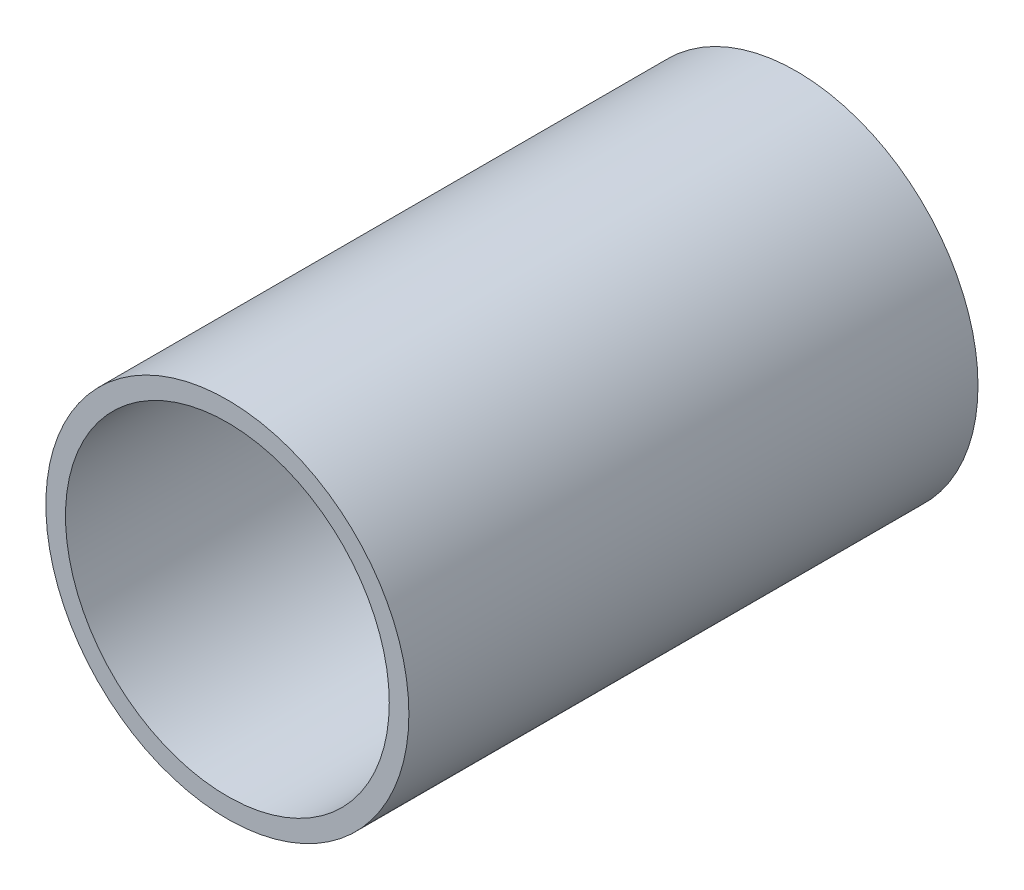
ISO-10303-21;
HEADER;
FILE_DESCRIPTION(('STEP AP214'),'2;1');
FILE_NAME('part.step','',(''),(''),'','','');
FILE_SCHEMA(('AUTOMOTIVE_DESIGN { 1 0 10303 214 1 1 1 1 }'));
ENDSEC;
DATA;
#1=APPLICATION_CONTEXT('core data for automotive mechanical design processes');
#2=APPLICATION_PROTOCOL_DEFINITION('international standard','automotive_design',2000,#1);
#3=PRODUCT_CONTEXT('',#1,'mechanical');
#4=PRODUCT('Part','Part','',(#3));
#5=PRODUCT_RELATED_PRODUCT_CATEGORY('part','',(#4));
#6=PRODUCT_DEFINITION_FORMATION('','',#4);
#7=PRODUCT_DEFINITION_CONTEXT('part definition',#1,'design');
#8=PRODUCT_DEFINITION('design','',#6,#7);
#9=PRODUCT_DEFINITION_SHAPE('','',#8);
#10=(LENGTH_UNIT() NAMED_UNIT(*) SI_UNIT(.MILLI.,.METRE.));
#11=(NAMED_UNIT(*) PLANE_ANGLE_UNIT() SI_UNIT($,.RADIAN.));
#12=(NAMED_UNIT(*) SI_UNIT($,.STERADIAN.) SOLID_ANGLE_UNIT());
#13=UNCERTAINTY_MEASURE_WITH_UNIT(LENGTH_MEASURE(1.E-05),#10,'distance_accuracy_value','');
#14=(GEOMETRIC_REPRESENTATION_CONTEXT(3) GLOBAL_UNCERTAINTY_ASSIGNED_CONTEXT((#13)) GLOBAL_UNIT_ASSIGNED_CONTEXT((#10,
#11,#12)) REPRESENTATION_CONTEXT('',''));
#15=CARTESIAN_POINT('',(0.,0.,0.));
#16=DIRECTION('',(0.,0.,1.));
#17=DIRECTION('',(1.,0.,0.));
#18=AXIS2_PLACEMENT_3D('',#15,#16,#17);
#19=CARTESIAN_POINT('',(0.,0.,-2.5));
#20=DIRECTION('',(0.,0.,1.));
#21=DIRECTION('',(1.,0.,0.));
#22=AXIS2_PLACEMENT_3D('',#19,#20,#21);
#23=CYLINDRICAL_SURFACE('',#22,1.65);
#24=CARTESIAN_POINT('',(0.,0.,-8.3));
#25=DIRECTION('',(0.,0.,1.));
#26=DIRECTION('',(1.,0.,0.));
#27=AXIS2_PLACEMENT_3D('',#24,#25,#26);
#28=CIRCLE('',#27,1.65);
#29=CARTESIAN_POINT('',(1.65,0.,-8.3));
#30=VERTEX_POINT('',#29);
#31=EDGE_CURVE('E27',#30,#30,#28,.T.);
#32=ORIENTED_EDGE('',*,*,#31,.F.);
#33=EDGE_LOOP('',(#32));
#34=FACE_BOUND('',#33,.T.);
#35=CARTESIAN_POINT('',(0.,0.,-2.5));
#36=DIRECTION('',(0.,0.,1.));
#37=DIRECTION('',(1.,0.,0.));
#38=AXIS2_PLACEMENT_3D('',#35,#36,#37);
#39=CIRCLE('',#38,1.65);
#40=CARTESIAN_POINT('',(1.65,0.,-2.5));
#41=VERTEX_POINT('',#40);
#42=EDGE_CURVE('E18',#41,#41,#39,.T.);
#43=ORIENTED_EDGE('',*,*,#42,.T.);
#44=EDGE_LOOP('',(#43));
#45=FACE_BOUND('',#44,.T.);
#46=ADVANCED_FACE('F15',(#34,#45),#23,.F.);
#47=CARTESIAN_POINT('',(0.,0.,-2.5));
#48=DIRECTION('',(0.,0.,-1.));
#49=DIRECTION('',(-1.,0.,0.));
#50=AXIS2_PLACEMENT_3D('',#47,#48,#49);
#51=PLANE('',#50);
#52=ORIENTED_EDGE('',*,*,#42,.F.);
#53=EDGE_LOOP('',(#52));
#54=FACE_BOUND('',#53,.T.);
#55=CARTESIAN_POINT('',(0.,0.,-2.5));
#56=DIRECTION('',(0.,0.,1.));
#57=DIRECTION('',(1.,0.,0.));
#58=AXIS2_PLACEMENT_3D('',#55,#56,#57);
#59=CIRCLE('',#58,1.85);
#60=CARTESIAN_POINT('',(1.85,0.,-2.5));
#61=VERTEX_POINT('',#60);
#62=EDGE_CURVE('E22',#61,#61,#59,.F.);
#63=ORIENTED_EDGE('',*,*,#62,.F.);
#64=EDGE_LOOP('',(#63));
#65=FACE_BOUND('',#64,.T.);
#66=ADVANCED_FACE('F36',(#54,#65),#51,.F.);
#67=CARTESIAN_POINT('',(0.,0.,-8.3));
#68=DIRECTION('',(0.,0.,-1.));
#69=DIRECTION('',(-1.,0.,0.));
#70=AXIS2_PLACEMENT_3D('',#67,#68,#69);
#71=PLANE('',#70);
#72=ORIENTED_EDGE('',*,*,#31,.T.);
#73=EDGE_LOOP('',(#72));
#74=FACE_BOUND('',#73,.T.);
#75=CARTESIAN_POINT('',(0.,0.,-8.3));
#76=DIRECTION('',(0.,0.,1.));
#77=DIRECTION('',(1.,0.,0.));
#78=AXIS2_PLACEMENT_3D('',#75,#76,#77);
#79=CIRCLE('',#78,1.85);
#80=CARTESIAN_POINT('',(1.85,0.,-8.3));
#81=VERTEX_POINT('',#80);
#82=EDGE_CURVE('E10',#81,#81,#79,.T.);
#83=ORIENTED_EDGE('',*,*,#82,.F.);
#84=EDGE_LOOP('',(#83));
#85=FACE_BOUND('',#84,.T.);
#86=ADVANCED_FACE('F39',(#74,#85),#71,.T.);
#87=CARTESIAN_POINT('',(0.,0.,-2.5));
#88=DIRECTION('',(0.,0.,1.));
#89=DIRECTION('',(1.,0.,0.));
#90=AXIS2_PLACEMENT_3D('',#87,#88,#89);
#91=CYLINDRICAL_SURFACE('',#90,1.85);
#92=ORIENTED_EDGE('',*,*,#82,.T.);
#93=EDGE_LOOP('',(#92));
#94=FACE_BOUND('',#93,.T.);
#95=ORIENTED_EDGE('',*,*,#62,.T.);
#96=EDGE_LOOP('',(#95));
#97=FACE_BOUND('',#96,.T.);
#98=ADVANCED_FACE('F42',(#94,#97),#91,.T.);
#99=CLOSED_SHELL('',(#46,#66,#86,#98));
#100=MANIFOLD_SOLID_BREP('B1',#99);
#101=ADVANCED_BREP_SHAPE_REPRESENTATION('',(#18,#100),#14);
#102=SHAPE_DEFINITION_REPRESENTATION(#9,#101);
ENDSEC;
END-ISO-10303-21;
